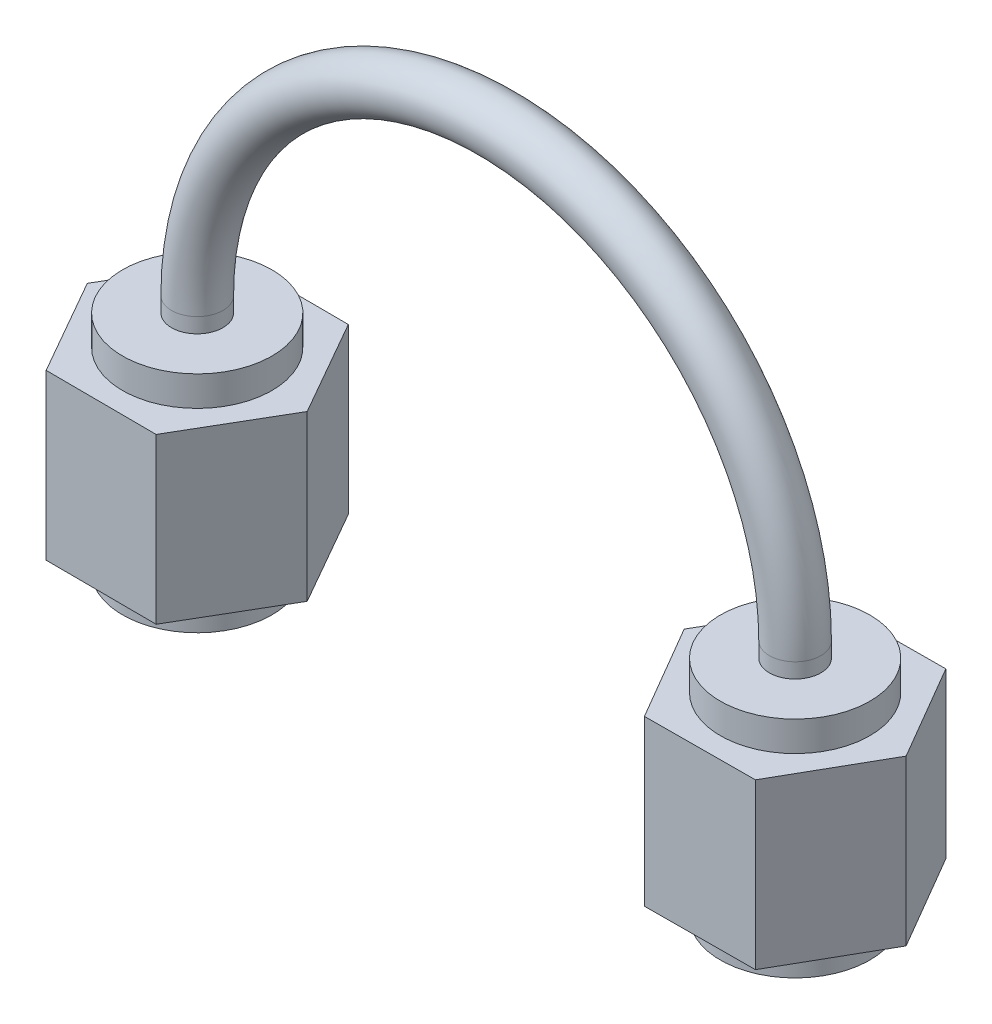
ISO-10303-21;
HEADER;
FILE_DESCRIPTION(('STEP AP214'),'2;1');
FILE_NAME('part.step','',(''),(''),'','','');
FILE_SCHEMA(('AUTOMOTIVE_DESIGN { 1 0 10303 214 1 1 1 1 }'));
ENDSEC;
DATA;
#1=APPLICATION_CONTEXT('core data for automotive mechanical design processes');
#2=APPLICATION_PROTOCOL_DEFINITION('international standard','automotive_design',2000,#1);
#3=PRODUCT_CONTEXT('',#1,'mechanical');
#4=PRODUCT('Part','Part','',(#3));
#5=PRODUCT_RELATED_PRODUCT_CATEGORY('part','',(#4));
#6=PRODUCT_DEFINITION_FORMATION('','',#4);
#7=PRODUCT_DEFINITION_CONTEXT('part definition',#1,'design');
#8=PRODUCT_DEFINITION('design','',#6,#7);
#9=PRODUCT_DEFINITION_SHAPE('','',#8);
#10=(LENGTH_UNIT() NAMED_UNIT(*) SI_UNIT(.MILLI.,.METRE.));
#11=(NAMED_UNIT(*) PLANE_ANGLE_UNIT() SI_UNIT($,.RADIAN.));
#12=(NAMED_UNIT(*) SI_UNIT($,.STERADIAN.) SOLID_ANGLE_UNIT());
#13=UNCERTAINTY_MEASURE_WITH_UNIT(LENGTH_MEASURE(1.E-05),#10,'distance_accuracy_value','');
#14=(GEOMETRIC_REPRESENTATION_CONTEXT(3) GLOBAL_UNCERTAINTY_ASSIGNED_CONTEXT((#13)) GLOBAL_UNIT_ASSIGNED_CONTEXT((#10,
#11,#12)) REPRESENTATION_CONTEXT('',''));
#15=CARTESIAN_POINT('',(0.,0.,0.));
#16=DIRECTION('',(0.,0.,1.));
#17=DIRECTION('',(1.,0.,0.));
#18=AXIS2_PLACEMENT_3D('',#15,#16,#17);
#19=CARTESIAN_POINT('',(-12.7,9.525,0.));
#20=DIRECTION('',(0.,-1.,0.));
#21=DIRECTION('',(0.,0.,-1.));
#22=AXIS2_PLACEMENT_3D('',#19,#20,#21);
#23=CYLINDRICAL_SURFACE('',#22,3.175);
#24=CARTESIAN_POINT('',(-12.7,0.,0.));
#25=DIRECTION('',(0.,1.,0.));
#26=DIRECTION('',(0.,0.,1.));
#27=AXIS2_PLACEMENT_3D('',#24,#25,#26);
#28=CIRCLE('',#27,3.175);
#29=CARTESIAN_POINT('',(-12.7,0.,-3.175));
#30=VERTEX_POINT('',#29);
#31=EDGE_CURVE('E180',#30,#30,#28,.T.);
#32=CARTESIAN_POINT('',(-12.7,1.27,0.));
#33=DIRECTION('',(0.,1.,0.));
#34=DIRECTION('',(0.,0.,1.));
#35=AXIS2_PLACEMENT_3D('',#32,#33,#34);
#36=CIRCLE('',#35,3.175);
#37=CARTESIAN_POINT('',(-12.7,1.27,-3.175));
#38=VERTEX_POINT('',#37);
#39=EDGE_CURVE('E47',#38,#38,#36,.T.);
#40=CARTESIAN_POINT('',(-12.7,0.,-3.175));
#41=CARTESIAN_POINT('',(-12.7,0.0132291666666666,-3.175));
#42=CARTESIAN_POINT('',(-12.7,0.0264583333333332,-3.175));
#43=CARTESIAN_POINT('',(-12.7,0.0529166666666664,-3.175));
#44=CARTESIAN_POINT('',(-12.7,0.066145833333333,-3.175));
#45=CARTESIAN_POINT('',(-12.7,0.0926041666666662,-3.175));
#46=CARTESIAN_POINT('',(-12.7,0.105833333333333,-3.175));
#47=CARTESIAN_POINT('',(-12.7,0.132291666666666,-3.175));
#48=CARTESIAN_POINT('',(-12.7,0.145520833333333,-3.175));
#49=CARTESIAN_POINT('',(-12.7,0.171979166666666,-3.175));
#50=CARTESIAN_POINT('',(-12.7,0.185208333333334,-3.175));
#51=CARTESIAN_POINT('',(-12.7,0.211666666666667,-3.175));
#52=CARTESIAN_POINT('',(-12.7,0.224895833333334,-3.175));
#53=CARTESIAN_POINT('',(-12.7,0.251354166666667,-3.175));
#54=CARTESIAN_POINT('',(-12.7,0.264583333333334,-3.175));
#55=CARTESIAN_POINT('',(-12.7,0.291041666666667,-3.175));
#56=CARTESIAN_POINT('',(-12.7,0.304270833333333,-3.175));
#57=CARTESIAN_POINT('',(-12.7,0.330729166666667,-3.175));
#58=CARTESIAN_POINT('',(-12.7,0.343958333333333,-3.175));
#59=CARTESIAN_POINT('',(-12.7,0.370416666666666,-3.175));
#60=CARTESIAN_POINT('',(-12.7,0.383645833333333,-3.175));
#61=CARTESIAN_POINT('',(-12.7,0.410104166666666,-3.175));
#62=CARTESIAN_POINT('',(-12.7,0.423333333333333,-3.175));
#63=CARTESIAN_POINT('',(-12.7,0.449791666666667,-3.175));
#64=CARTESIAN_POINT('',(-12.7,0.463020833333334,-3.175));
#65=CARTESIAN_POINT('',(-12.7,0.489479166666668,-3.175));
#66=CARTESIAN_POINT('',(-12.7,0.502708333333334,-3.175));
#67=CARTESIAN_POINT('',(-12.7,0.529166666666667,-3.175));
#68=CARTESIAN_POINT('',(-12.7,0.542395833333334,-3.175));
#69=CARTESIAN_POINT('',(-12.7,0.568854166666667,-3.175));
#70=CARTESIAN_POINT('',(-12.7,0.582083333333334,-3.175));
#71=CARTESIAN_POINT('',(-12.7,0.608541666666667,-3.175));
#72=CARTESIAN_POINT('',(-12.7,0.621770833333334,-3.175));
#73=CARTESIAN_POINT('',(-12.7,0.648229166666667,-3.175));
#74=CARTESIAN_POINT('',(-12.7,0.661458333333333,-3.175));
#75=CARTESIAN_POINT('',(-12.7,0.687916666666667,-3.175));
#76=CARTESIAN_POINT('',(-12.7,0.701145833333333,-3.175));
#77=CARTESIAN_POINT('',(-12.7,0.727604166666666,-3.175));
#78=CARTESIAN_POINT('',(-12.7,0.740833333333333,-3.175));
#79=CARTESIAN_POINT('',(-12.7,0.767291666666666,-3.175));
#80=CARTESIAN_POINT('',(-12.7,0.780520833333333,-3.175));
#81=CARTESIAN_POINT('',(-12.7,0.806979166666666,-3.175));
#82=CARTESIAN_POINT('',(-12.7,0.820208333333334,-3.175));
#83=CARTESIAN_POINT('',(-12.7,0.846666666666667,-3.175));
#84=CARTESIAN_POINT('',(-12.7,0.859895833333334,-3.175));
#85=CARTESIAN_POINT('',(-12.7,0.886354166666667,-3.175));
#86=CARTESIAN_POINT('',(-12.7,0.899583333333334,-3.175));
#87=CARTESIAN_POINT('',(-12.7,0.926041666666667,-3.175));
#88=CARTESIAN_POINT('',(-12.7,0.939270833333334,-3.175));
#89=CARTESIAN_POINT('',(-12.7,0.965729166666667,-3.175));
#90=CARTESIAN_POINT('',(-12.7,0.978958333333333,-3.175));
#91=CARTESIAN_POINT('',(-12.7,1.00541666666667,-3.175));
#92=CARTESIAN_POINT('',(-12.7,1.01864583333333,-3.175));
#93=CARTESIAN_POINT('',(-12.7,1.04510416666667,-3.175));
#94=CARTESIAN_POINT('',(-12.7,1.05833333333333,-3.175));
#95=CARTESIAN_POINT('',(-12.7,1.08479166666667,-3.175));
#96=CARTESIAN_POINT('',(-12.7,1.09802083333333,-3.175));
#97=CARTESIAN_POINT('',(-12.7,1.12447916666667,-3.175));
#98=CARTESIAN_POINT('',(-12.7,1.13770833333333,-3.175));
#99=CARTESIAN_POINT('',(-12.7,1.16416666666667,-3.175));
#100=CARTESIAN_POINT('',(-12.7,1.17739583333333,-3.175));
#101=CARTESIAN_POINT('',(-12.7,1.20385416666667,-3.175));
#102=CARTESIAN_POINT('',(-12.7,1.21708333333333,-3.175));
#103=CARTESIAN_POINT('',(-12.7,1.24354166666667,-3.175));
#104=CARTESIAN_POINT('',(-12.7,1.25677083333333,-3.175));
#105=CARTESIAN_POINT('',(-12.7,1.27,-3.175));
#106=B_SPLINE_CURVE_WITH_KNOTS('',3,(#40,#41,#42,#43,#44,#45,#46,#47,#48,#49,#50,#51,#52,#53,
#54,#55,#56,#57,#58,#59,#60,#61,#62,#63,#64,#65,#66,#67,#68,#69,#70,#71,#72,#73,#74,#75,#76,#77,
#78,#79,#80,#81,#82,#83,#84,#85,#86,#87,#88,#89,#90,#91,#92,#93,#94,#95,#96,#97,#98,#99,#100,
#101,#102,#103,#104,#105),.UNSPECIFIED.,.F.,.F.,(4,2,2,2,2,2,2,2,2,2,2,2,2,2,2,2,2,2,2,2,2,2,2,
2,2,2,2,2,2,2,2,2,4),(0.,0.0396874999999998,0.0793749999999996,0.119062499999999,
0.158749999999999,0.198437500000001,0.238125,0.2778125,0.3175,0.3571875,0.396875,
0.436562499999999,0.476250000000001,0.515937500000001,0.555625000000001,0.5953125,0.635,
0.6746875,0.714375,0.7540625,0.793749999999999,0.833437500000001,0.873125000000001,0.9128125,
0.9525,0.9921875,1.031875,1.0715625,1.11125,1.1509375,1.190625,1.2303125,1.27),.UNSPECIFIED.);
#107=EDGE_CURVE('BSEAM43',#30,#38,#106,.T.);
#108=ORIENTED_EDGE('',*,*,#31,.T.);
#109=ORIENTED_EDGE('',*,*,#39,.F.);
#110=ORIENTED_EDGE('',*,*,#107,.T.);
#111=ORIENTED_EDGE('',*,*,#107,.F.);
#112=EDGE_LOOP('',(#108,#110,#109,#111));
#113=FACE_BOUND('',#112,.T.);
#114=ADVANCED_FACE('F43',(#113),#23,.T.);
#115=CARTESIAN_POINT('',(-12.7,0.,0.));
#116=DIRECTION('',(0.,1.,0.));
#117=DIRECTION('',(0.,0.,1.));
#118=AXIS2_PLACEMENT_3D('',#115,#116,#117);
#119=PLANE('',#118);
#120=ORIENTED_EDGE('',*,*,#31,.F.);
#121=EDGE_LOOP('',(#120));
#122=FACE_BOUND('',#121,.T.);
#123=ADVANCED_FACE('F207',(#122),#119,.F.);
#124=CARTESIAN_POINT('',(-10.3724723460019,1.27,4.07480997755817));
#125=DIRECTION('',(0.863703301815548,0.,0.504000601619602));
#126=DIRECTION('',(0.504000601619602,0.,-0.863703301815548));
#127=AXIS2_PLACEMENT_3D('',#124,#125,#126);
#128=PLANE('',#127);
#129=DIRECTION('',(0.504000601619602,0.,-0.863703301815548));
#130=VECTOR('',#129,1.);
#131=CARTESIAN_POINT('',(-10.3724723460019,8.255,4.07480997755817));
#132=LINE('',#131,#130);
#133=CARTESIAN_POINT('',(-10.3724723460019,8.255,4.07480997755817));
#134=VERTEX_POINT('',#133);
#135=CARTESIAN_POINT('',(-8.0073472168413,8.255,0.0217069124059622));
#136=VERTEX_POINT('',#135);
#137=EDGE_CURVE('E141',#134,#136,#132,.T.);
#138=ORIENTED_EDGE('',*,*,#137,.F.);
#139=DIRECTION('',(0.,1.,0.));
#140=VECTOR('',#139,1.);
#141=CARTESIAN_POINT('',(-10.3724723460019,1.27,4.07480997755817));
#142=LINE('',#141,#140);
#143=CARTESIAN_POINT('',(-10.3724723460019,1.27,4.07480997755817));
#144=VERTEX_POINT('',#143);
#145=EDGE_CURVE('E62',#144,#134,#142,.T.);
#146=ORIENTED_EDGE('',*,*,#145,.F.);
#147=DIRECTION('',(0.504000601619602,0.,-0.863703301815548));
#148=VECTOR('',#147,1.);
#149=CARTESIAN_POINT('',(-10.3724723460019,1.27,4.07480997755817));
#150=LINE('',#149,#148);
#151=CARTESIAN_POINT('',(-8.0073472168413,1.27,0.0217069124059622));
#152=VERTEX_POINT('',#151);
#153=EDGE_CURVE('E163',#144,#152,#150,.T.);
#154=ORIENTED_EDGE('',*,*,#153,.T.);
#155=DIRECTION('',(0.,1.,0.));
#156=VECTOR('',#155,1.);
#157=CARTESIAN_POINT('',(-8.0073472168413,1.27,0.0217069124059622));
#158=LINE('',#157,#156);
#159=EDGE_CURVE('E98',#152,#136,#158,.T.);
#160=ORIENTED_EDGE('',*,*,#159,.T.);
#161=EDGE_LOOP('',(#138,#146,#154,#160));
#162=FACE_BOUND('',#161,.T.);
#163=ADVANCED_FACE('F194',(#162),#128,.T.);
#164=CARTESIAN_POINT('',(-15.0651251291606,1.27,4.05310306515221));
#165=DIRECTION('',(-0.00462567361744097,0.,0.999989301514564));
#166=DIRECTION('',(0.999989301514564,0.,0.00462567361744097));
#167=AXIS2_PLACEMENT_3D('',#164,#165,#166);
#168=PLANE('',#167);
#169=DIRECTION('',(0.999989301514564,0.,0.00462567361744097));
#170=VECTOR('',#169,1.);
#171=CARTESIAN_POINT('',(-15.0651251291606,8.255,4.05310306515221));
#172=LINE('',#171,#170);
#173=CARTESIAN_POINT('',(-15.0651251291606,8.255,4.05310306515221));
#174=VERTEX_POINT('',#173);
#175=EDGE_CURVE('E159',#174,#134,#172,.T.);
#176=ORIENTED_EDGE('',*,*,#175,.F.);
#177=DIRECTION('',(0.,1.,0.));
#178=VECTOR('',#177,1.);
#179=CARTESIAN_POINT('',(-15.0651251291606,1.27,4.05310306515221));
#180=LINE('',#179,#178);
#181=CARTESIAN_POINT('',(-15.0651251291606,1.27,4.05310306515221));
#182=VERTEX_POINT('',#181);
#183=EDGE_CURVE('E86',#182,#174,#180,.T.);
#184=ORIENTED_EDGE('',*,*,#183,.F.);
#185=DIRECTION('',(0.999989301514564,0.,0.00462567361744097));
#186=VECTOR('',#185,1.);
#187=CARTESIAN_POINT('',(-15.0651251291606,1.27,4.05310306515221));
#188=LINE('',#187,#186);
#189=EDGE_CURVE('E127',#182,#144,#188,.T.);
#190=ORIENTED_EDGE('',*,*,#189,.T.);
#191=ORIENTED_EDGE('',*,*,#145,.T.);
#192=EDGE_LOOP('',(#176,#184,#190,#191));
#193=FACE_BOUND('',#192,.T.);
#194=ADVANCED_FACE('F199',(#193),#168,.T.);
#195=CARTESIAN_POINT('',(-17.3926527831587,1.27,-0.0217069124059601));
#196=DIRECTION('',(-0.86832897543299,0.,0.495988699894962));
#197=DIRECTION('',(0.495988699894962,0.,0.86832897543299));
#198=AXIS2_PLACEMENT_3D('',#195,#196,#197);
#199=PLANE('',#198);
#200=DIRECTION('',(0.495988699894962,0.,0.86832897543299));
#201=VECTOR('',#200,1.);
#202=CARTESIAN_POINT('',(-17.3926527831587,8.255,-0.0217069124059601));
#203=LINE('',#202,#201);
#204=CARTESIAN_POINT('',(-17.3926527831587,8.255,-0.0217069124059601));
#205=VERTEX_POINT('',#204);
#206=EDGE_CURVE('E113',#205,#174,#203,.T.);
#207=ORIENTED_EDGE('',*,*,#206,.F.);
#208=DIRECTION('',(0.,1.,0.));
#209=VECTOR('',#208,1.);
#210=CARTESIAN_POINT('',(-17.3926527831587,1.27,-0.0217069124059601));
#211=LINE('',#210,#209);
#212=CARTESIAN_POINT('',(-17.3926527831587,1.27,-0.0217069124059601));
#213=VERTEX_POINT('',#212);
#214=EDGE_CURVE('E108',#213,#205,#211,.T.);
#215=ORIENTED_EDGE('',*,*,#214,.F.);
#216=DIRECTION('',(0.495988699894962,0.,0.86832897543299));
#217=VECTOR('',#216,1.);
#218=CARTESIAN_POINT('',(-17.3926527831587,1.27,-0.0217069124059601));
#219=LINE('',#218,#217);
#220=EDGE_CURVE('E111',#213,#182,#219,.T.);
#221=ORIENTED_EDGE('',*,*,#220,.T.);
#222=ORIENTED_EDGE('',*,*,#183,.T.);
#223=EDGE_LOOP('',(#207,#215,#221,#222));
#224=FACE_BOUND('',#223,.T.);
#225=ADVANCED_FACE('F110',(#224),#199,.T.);
#226=CARTESIAN_POINT('',(-15.0275276539981,1.27,-4.07480997755817));
#227=DIRECTION('',(-0.863703301815547,0.,-0.504000601619602));
#228=DIRECTION('',(-0.504000601619602,0.,0.863703301815548));
#229=AXIS2_PLACEMENT_3D('',#226,#227,#228);
#230=PLANE('',#229);
#231=DIRECTION('',(-0.504000601619603,0.,0.863703301815548));
#232=VECTOR('',#231,1.);
#233=CARTESIAN_POINT('',(-15.0275276539981,8.255,-4.07480997755817));
#234=LINE('',#233,#232);
#235=CARTESIAN_POINT('',(-15.0275276539981,8.255,-4.07480997755817));
#236=VERTEX_POINT('',#235);
#237=EDGE_CURVE('E154',#236,#205,#234,.T.);
#238=ORIENTED_EDGE('',*,*,#237,.F.);
#239=DIRECTION('',(0.,1.,0.));
#240=VECTOR('',#239,1.);
#241=CARTESIAN_POINT('',(-15.0275276539981,1.27,-4.07480997755817));
#242=LINE('',#241,#240);
#243=CARTESIAN_POINT('',(-15.0275276539981,1.27,-4.07480997755817));
#244=VERTEX_POINT('',#243);
#245=EDGE_CURVE('E119',#244,#236,#242,.T.);
#246=ORIENTED_EDGE('',*,*,#245,.F.);
#247=DIRECTION('',(-0.504000601619603,0.,0.863703301815548));
#248=VECTOR('',#247,1.);
#249=CARTESIAN_POINT('',(-15.0275276539981,1.27,-4.07480997755817));
#250=LINE('',#249,#248);
#251=EDGE_CURVE('E125',#244,#213,#250,.T.);
#252=ORIENTED_EDGE('',*,*,#251,.T.);
#253=ORIENTED_EDGE('',*,*,#214,.T.);
#254=EDGE_LOOP('',(#238,#246,#252,#253));
#255=FACE_BOUND('',#254,.T.);
#256=ADVANCED_FACE('F130',(#255),#230,.T.);
#257=CARTESIAN_POINT('',(-10.3348748708394,1.27,-4.05310306515221));
#258=DIRECTION('',(0.00462567361744134,0.,-0.999989301514564));
#259=DIRECTION('',(-0.999989301514564,0.,-0.00462567361744134));
#260=AXIS2_PLACEMENT_3D('',#257,#258,#259);
#261=PLANE('',#260);
#262=DIRECTION('',(-0.999989301514564,0.,-0.00462567361744134));
#263=VECTOR('',#262,1.);
#264=CARTESIAN_POINT('',(-10.3348748708394,8.255,-4.05310306515221));
#265=LINE('',#264,#263);
#266=CARTESIAN_POINT('',(-10.3348748708394,8.255,-4.05310306515221));
#267=VERTEX_POINT('',#266);
#268=EDGE_CURVE('E150',#267,#236,#265,.T.);
#269=ORIENTED_EDGE('',*,*,#268,.F.);
#270=DIRECTION('',(0.,1.,0.));
#271=VECTOR('',#270,1.);
#272=CARTESIAN_POINT('',(-10.3348748708394,1.27,-4.05310306515221));
#273=LINE('',#272,#271);
#274=CARTESIAN_POINT('',(-10.3348748708394,1.27,-4.05310306515221));
#275=VERTEX_POINT('',#274);
#276=EDGE_CURVE('E171',#275,#267,#273,.T.);
#277=ORIENTED_EDGE('',*,*,#276,.F.);
#278=DIRECTION('',(-0.999989301514564,0.,-0.00462567361744134));
#279=VECTOR('',#278,1.);
#280=CARTESIAN_POINT('',(-10.3348748708394,1.27,-4.05310306515221));
#281=LINE('',#280,#279);
#282=EDGE_CURVE('E132',#275,#244,#281,.T.);
#283=ORIENTED_EDGE('',*,*,#282,.T.);
#284=ORIENTED_EDGE('',*,*,#245,.T.);
#285=EDGE_LOOP('',(#269,#277,#283,#284));
#286=FACE_BOUND('',#285,.T.);
#287=ADVANCED_FACE('F198',(#286),#261,.T.);
#288=CARTESIAN_POINT('',(-8.0073472168413,1.27,0.0217069124059622));
#289=DIRECTION('',(0.86832897543299,0.,-0.495988699894961));
#290=DIRECTION('',(-0.495988699894961,0.,-0.86832897543299));
#291=AXIS2_PLACEMENT_3D('',#288,#289,#290);
#292=PLANE('',#291);
#293=DIRECTION('',(-0.495988699894961,0.,-0.86832897543299));
#294=VECTOR('',#293,1.);
#295=CARTESIAN_POINT('',(-8.0073472168413,8.255,0.0217069124059622));
#296=LINE('',#295,#294);
#297=EDGE_CURVE('E145',#136,#267,#296,.T.);
#298=ORIENTED_EDGE('',*,*,#297,.F.);
#299=ORIENTED_EDGE('',*,*,#159,.F.);
#300=DIRECTION('',(-0.495988699894961,0.,-0.86832897543299));
#301=VECTOR('',#300,1.);
#302=CARTESIAN_POINT('',(-8.0073472168413,1.27,0.0217069124059622));
#303=LINE('',#302,#301);
#304=EDGE_CURVE('E135',#152,#275,#303,.T.);
#305=ORIENTED_EDGE('',*,*,#304,.T.);
#306=ORIENTED_EDGE('',*,*,#276,.T.);
#307=EDGE_LOOP('',(#298,#299,#305,#306));
#308=FACE_BOUND('',#307,.T.);
#309=ADVANCED_FACE('F195',(#308),#292,.T.);
#310=CARTESIAN_POINT('',(0.,1.27,0.));
#311=DIRECTION('',(0.,1.,0.));
#312=DIRECTION('',(0.,0.,1.));
#313=AXIS2_PLACEMENT_3D('',#310,#311,#312);
#314=PLANE('',#313);
#315=ORIENTED_EDGE('',*,*,#39,.T.);
#316=EDGE_LOOP('',(#315));
#317=FACE_BOUND('',#316,.T.);
#318=ORIENTED_EDGE('',*,*,#153,.F.);
#319=ORIENTED_EDGE('',*,*,#189,.F.);
#320=ORIENTED_EDGE('',*,*,#220,.F.);
#321=ORIENTED_EDGE('',*,*,#251,.F.);
#322=ORIENTED_EDGE('',*,*,#282,.F.);
#323=ORIENTED_EDGE('',*,*,#304,.F.);
#324=EDGE_LOOP('',(#318,#319,#320,#321,#322,#323));
#325=FACE_BOUND('',#324,.T.);
#326=ADVANCED_FACE('F123',(#317,#325),#314,.F.);
#327=CARTESIAN_POINT('',(0.,8.255,0.));
#328=DIRECTION('',(0.,1.,0.));
#329=DIRECTION('',(0.,0.,1.));
#330=AXIS2_PLACEMENT_3D('',#327,#328,#329);
#331=PLANE('',#330);
#332=CARTESIAN_POINT('',(-12.7,8.255,0.));
#333=DIRECTION('',(0.,1.,0.));
#334=DIRECTION('',(0.,0.,1.));
#335=AXIS2_PLACEMENT_3D('',#332,#333,#334);
#336=CIRCLE('',#335,3.175);
#337=CARTESIAN_POINT('',(-12.7,8.255,-3.175));
#338=VERTEX_POINT('',#337);
#339=EDGE_CURVE('E166',#338,#338,#336,.T.);
#340=ORIENTED_EDGE('',*,*,#339,.F.);
#341=EDGE_LOOP('',(#340));
#342=FACE_BOUND('',#341,.T.);
#343=ORIENTED_EDGE('',*,*,#137,.T.);
#344=ORIENTED_EDGE('',*,*,#297,.T.);
#345=ORIENTED_EDGE('',*,*,#268,.T.);
#346=ORIENTED_EDGE('',*,*,#237,.T.);
#347=ORIENTED_EDGE('',*,*,#206,.T.);
#348=ORIENTED_EDGE('',*,*,#175,.T.);
#349=EDGE_LOOP('',(#343,#344,#345,#346,#347,#348));
#350=FACE_BOUND('',#349,.T.);
#351=ADVANCED_FACE('F189',(#342,#350),#331,.T.);
#352=CARTESIAN_POINT('',(-12.7,9.525,0.));
#353=DIRECTION('',(0.,1.,0.));
#354=DIRECTION('',(0.,0.,1.));
#355=AXIS2_PLACEMENT_3D('',#352,#353,#354);
#356=PLANE('',#355);
#357=CARTESIAN_POINT('',(-12.7,9.525,0.));
#358=DIRECTION('',(0.,1.,0.));
#359=DIRECTION('',(0.,0.,1.));
#360=AXIS2_PLACEMENT_3D('',#357,#358,#359);
#361=CIRCLE('',#360,1.0922);
#362=CARTESIAN_POINT('',(-12.7,9.525,1.0922));
#363=VERTEX_POINT('',#362);
#364=EDGE_CURVE('E11',#363,#363,#361,.T.);
#365=ORIENTED_EDGE('',*,*,#364,.F.);
#366=EDGE_LOOP('',(#365));
#367=FACE_BOUND('',#366,.T.);
#368=CARTESIAN_POINT('',(-12.7,9.525,0.));
#369=DIRECTION('',(0.,1.,0.));
#370=DIRECTION('',(0.,0.,1.));
#371=AXIS2_PLACEMENT_3D('',#368,#369,#370);
#372=CIRCLE('',#371,3.175);
#373=CARTESIAN_POINT('',(-12.7,9.525,-3.175));
#374=VERTEX_POINT('',#373);
#375=EDGE_CURVE('E176',#374,#374,#372,.T.);
#376=ORIENTED_EDGE('',*,*,#375,.T.);
#377=EDGE_LOOP('',(#376));
#378=FACE_BOUND('',#377,.T.);
#379=ADVANCED_FACE('F192',(#367,#378),#356,.T.);
#380=CARTESIAN_POINT('',(-12.7,8.255,-3.175));
#381=CARTESIAN_POINT('',(-12.7,8.26822916666667,-3.175));
#382=CARTESIAN_POINT('',(-12.7,8.28145833333333,-3.175));
#383=CARTESIAN_POINT('',(-12.7,8.30791666666667,-3.175));
#384=CARTESIAN_POINT('',(-12.7,8.32114583333333,-3.175));
#385=CARTESIAN_POINT('',(-12.7,8.34760416666667,-3.175));
#386=CARTESIAN_POINT('',(-12.7,8.36083333333333,-3.175));
#387=CARTESIAN_POINT('',(-12.7,8.38729166666667,-3.175));
#388=CARTESIAN_POINT('',(-12.7,8.40052083333333,-3.175));
#389=CARTESIAN_POINT('',(-12.7,8.42697916666667,-3.175));
#390=CARTESIAN_POINT('',(-12.7,8.44020833333333,-3.175));
#391=CARTESIAN_POINT('',(-12.7,8.46666666666667,-3.175));
#392=CARTESIAN_POINT('',(-12.7,8.47989583333333,-3.175));
#393=CARTESIAN_POINT('',(-12.7,8.50635416666667,-3.175));
#394=CARTESIAN_POINT('',(-12.7,8.51958333333333,-3.175));
#395=CARTESIAN_POINT('',(-12.7,8.54604166666667,-3.175));
#396=CARTESIAN_POINT('',(-12.7,8.55927083333333,-3.175));
#397=CARTESIAN_POINT('',(-12.7,8.58572916666667,-3.175));
#398=CARTESIAN_POINT('',(-12.7,8.59895833333333,-3.175));
#399=CARTESIAN_POINT('',(-12.7,8.62541666666667,-3.175));
#400=CARTESIAN_POINT('',(-12.7,8.63864583333333,-3.175));
#401=CARTESIAN_POINT('',(-12.7,8.66510416666667,-3.175));
#402=CARTESIAN_POINT('',(-12.7,8.67833333333333,-3.175));
#403=CARTESIAN_POINT('',(-12.7,8.70479166666667,-3.175));
#404=CARTESIAN_POINT('',(-12.7,8.71802083333333,-3.175));
#405=CARTESIAN_POINT('',(-12.7,8.74447916666667,-3.175));
#406=CARTESIAN_POINT('',(-12.7,8.75770833333333,-3.175));
#407=CARTESIAN_POINT('',(-12.7,8.78416666666667,-3.175));
#408=CARTESIAN_POINT('',(-12.7,8.79739583333333,-3.175));
#409=CARTESIAN_POINT('',(-12.7,8.82385416666667,-3.175));
#410=CARTESIAN_POINT('',(-12.7,8.83708333333333,-3.175));
#411=CARTESIAN_POINT('',(-12.7,8.86354166666666,-3.175));
#412=CARTESIAN_POINT('',(-12.7,8.87677083333333,-3.175));
#413=CARTESIAN_POINT('',(-12.7,8.90322916666667,-3.175));
#414=CARTESIAN_POINT('',(-12.7,8.91645833333333,-3.175));
#415=CARTESIAN_POINT('',(-12.7,8.94291666666667,-3.175));
#416=CARTESIAN_POINT('',(-12.7,8.95614583333333,-3.175));
#417=CARTESIAN_POINT('',(-12.7,8.98260416666667,-3.175));
#418=CARTESIAN_POINT('',(-12.7,8.99583333333333,-3.175));
#419=CARTESIAN_POINT('',(-12.7,9.02229166666667,-3.175));
#420=CARTESIAN_POINT('',(-12.7,9.03552083333333,-3.175));
#421=CARTESIAN_POINT('',(-12.7,9.06197916666667,-3.175));
#422=CARTESIAN_POINT('',(-12.7,9.07520833333333,-3.175));
#423=CARTESIAN_POINT('',(-12.7,9.10166666666667,-3.175));
#424=CARTESIAN_POINT('',(-12.7,9.11489583333333,-3.175));
#425=CARTESIAN_POINT('',(-12.7,9.14135416666667,-3.175));
#426=CARTESIAN_POINT('',(-12.7,9.15458333333333,-3.175));
#427=CARTESIAN_POINT('',(-12.7,9.18104166666667,-3.175));
#428=CARTESIAN_POINT('',(-12.7,9.19427083333333,-3.175));
#429=CARTESIAN_POINT('',(-12.7,9.22072916666667,-3.175));
#430=CARTESIAN_POINT('',(-12.7,9.23395833333333,-3.175));
#431=CARTESIAN_POINT('',(-12.7,9.26041666666667,-3.175));
#432=CARTESIAN_POINT('',(-12.7,9.27364583333333,-3.175));
#433=CARTESIAN_POINT('',(-12.7,9.30010416666667,-3.175));
#434=CARTESIAN_POINT('',(-12.7,9.31333333333333,-3.175));
#435=CARTESIAN_POINT('',(-12.7,9.33979166666667,-3.175));
#436=CARTESIAN_POINT('',(-12.7,9.35302083333333,-3.175));
#437=CARTESIAN_POINT('',(-12.7,9.37947916666667,-3.175));
#438=CARTESIAN_POINT('',(-12.7,9.39270833333333,-3.175));
#439=CARTESIAN_POINT('',(-12.7,9.41916666666667,-3.175));
#440=CARTESIAN_POINT('',(-12.7,9.43239583333333,-3.175));
#441=CARTESIAN_POINT('',(-12.7,9.45885416666667,-3.175));
#442=CARTESIAN_POINT('',(-12.7,9.47208333333333,-3.175));
#443=CARTESIAN_POINT('',(-12.7,9.49854166666667,-3.175));
#444=CARTESIAN_POINT('',(-12.7,9.51177083333333,-3.175));
#445=CARTESIAN_POINT('',(-12.7,9.525,-3.175));
#446=B_SPLINE_CURVE_WITH_KNOTS('',3,(#380,#381,#382,#383,#384,#385,#386,#387,#388,#389,#390,
#391,#392,#393,#394,#395,#396,#397,#398,#399,#400,#401,#402,#403,#404,#405,#406,#407,#408,#409,
#410,#411,#412,#413,#414,#415,#416,#417,#418,#419,#420,#421,#422,#423,#424,#425,#426,#427,#428,
#429,#430,#431,#432,#433,#434,#435,#436,#437,#438,#439,#440,#441,#442,#443,#444,#445),
.UNSPECIFIED.,.F.,.F.,(4,2,2,2,2,2,2,2,2,2,2,2,2,2,2,2,2,2,2,2,2,2,2,2,2,2,2,2,2,2,2,2,4),(0.,
0.0396874999999998,0.0793749999999996,0.119062499999999,0.158749999999999,0.198437499999999,
0.238124999999999,0.2778125,0.3175,0.3571875,0.396875,0.436562499999999,0.476249999999999,
0.515937499999999,0.555624999999999,0.595312499999999,0.635,0.6746875,0.714375,0.7540625,
0.793749999999999,0.833437499999999,0.873124999999999,0.912812499999999,0.9525,0.9921875,
1.031875,1.0715625,1.11125,1.1509375,1.190625,1.2303125,1.27),.UNSPECIFIED.);
#447=EDGE_CURVE('BSEAM45',#338,#374,#446,.T.);
#448=ORIENTED_EDGE('',*,*,#339,.T.);
#449=ORIENTED_EDGE('',*,*,#375,.F.);
#450=ORIENTED_EDGE('',*,*,#447,.T.);
#451=ORIENTED_EDGE('',*,*,#447,.F.);
#452=EDGE_LOOP('',(#448,#450,#449,#451));
#453=FACE_BOUND('',#452,.T.);
#454=ADVANCED_FACE('F45',(#453),#23,.T.);
#455=CARTESIAN_POINT('',(12.7,9.525,0.));
#456=DIRECTION('',(0.,1.,0.));
#457=DIRECTION('',(0.,0.,1.));
#458=AXIS2_PLACEMENT_3D('',#455,#456,#457);
#459=CYLINDRICAL_SURFACE('',#458,1.0922);
#460=CARTESIAN_POINT('',(12.7,10.16,0.));
#461=DIRECTION('',(0.,-1.,0.));
#462=DIRECTION('',(0.,0.,1.));
#463=AXIS2_PLACEMENT_3D('',#460,#461,#462);
#464=CIRCLE('',#463,1.0922);
#465=CARTESIAN_POINT('',(13.7922,10.16,0.));
#466=VERTEX_POINT('',#465);
#467=EDGE_CURVE('E484',#466,#466,#464,.T.);
#468=ORIENTED_EDGE('',*,*,#467,.T.);
#469=EDGE_LOOP('',(#468));
#470=FACE_BOUND('',#469,.T.);
#471=CARTESIAN_POINT('',(12.7,9.525,0.));
#472=DIRECTION('',(0.,-1.,0.));
#473=DIRECTION('',(0.,0.,1.));
#474=AXIS2_PLACEMENT_3D('',#471,#472,#473);
#475=CIRCLE('',#474,1.0922);
#476=CARTESIAN_POINT('',(12.7,9.525,1.0922));
#477=VERTEX_POINT('',#476);
#478=EDGE_CURVE('E480',#477,#477,#475,.T.);
#479=ORIENTED_EDGE('',*,*,#478,.F.);
#480=EDGE_LOOP('',(#479));
#481=FACE_BOUND('',#480,.T.);
#482=ADVANCED_FACE('F217',(#470,#481),#459,.T.);
#483=CARTESIAN_POINT('',(0.,10.16,0.));
#484=DIRECTION('',(0.,0.,1.));
#485=DIRECTION('',(1.,0.,0.));
#486=AXIS2_PLACEMENT_3D('',#483,#484,#485);
#487=TOROIDAL_SURFACE('',#486,12.7,1.0922);
#488=CARTESIAN_POINT('',(-12.7,10.16,0.));
#489=DIRECTION('',(0.,1.,0.));
#490=DIRECTION('',(0.,0.,1.));
#491=AXIS2_PLACEMENT_3D('',#488,#489,#490);
#492=CIRCLE('',#491,1.0922);
#493=CARTESIAN_POINT('',(-13.7922,10.16,0.));
#494=VERTEX_POINT('',#493);
#495=EDGE_CURVE('E146',#494,#494,#492,.T.);
#496=CARTESIAN_POINT('',(0.,10.16,0.));
#497=DIRECTION('',(0.,0.,1.));
#498=DIRECTION('',(1.,0.,0.));
#499=AXIS2_PLACEMENT_3D('',#496,#497,#498);
#500=CIRCLE('',#499,13.7922);
#501=EDGE_CURVE('',#466,#494,#500,.T.);
#502=ORIENTED_EDGE('',*,*,#467,.F.);
#503=ORIENTED_EDGE('',*,*,#495,.T.);
#504=ORIENTED_EDGE('',*,*,#501,.T.);
#505=ORIENTED_EDGE('',*,*,#501,.F.);
#506=EDGE_LOOP('',(#502,#504,#503,#505));
#507=FACE_BOUND('',#506,.T.);
#508=ADVANCED_FACE('F224',(#507),#487,.T.);
#509=CARTESIAN_POINT('',(-12.7,10.16,0.));
#510=DIRECTION('',(0.,-1.,0.));
#511=DIRECTION('',(0.,0.,-1.));
#512=AXIS2_PLACEMENT_3D('',#509,#510,#511);
#513=CYLINDRICAL_SURFACE('',#512,1.0922);
#514=ORIENTED_EDGE('',*,*,#364,.T.);
#515=EDGE_LOOP('',(#514));
#516=FACE_BOUND('',#515,.T.);
#517=ORIENTED_EDGE('',*,*,#495,.F.);
#518=EDGE_LOOP('',(#517));
#519=FACE_BOUND('',#518,.T.);
#520=ADVANCED_FACE('F218',(#516,#519),#513,.T.);
#521=CARTESIAN_POINT('',(12.7,9.525,0.));
#522=DIRECTION('',(0.,-1.,0.));
#523=DIRECTION('',(0.,0.,-1.));
#524=AXIS2_PLACEMENT_3D('',#521,#522,#523);
#525=CYLINDRICAL_SURFACE('',#524,3.17500000000001);
#526=CARTESIAN_POINT('',(12.7,0.,0.));
#527=DIRECTION('',(0.,1.,0.));
#528=DIRECTION('',(0.,0.,1.));
#529=AXIS2_PLACEMENT_3D('',#526,#527,#528);
#530=CIRCLE('',#529,3.17500000000001);
#531=CARTESIAN_POINT('',(12.7,0.,-3.17500000000001));
#532=VERTEX_POINT('',#531);
#533=EDGE_CURVE('E466',#532,#532,#530,.T.);
#534=CARTESIAN_POINT('',(12.7,1.27,0.));
#535=DIRECTION('',(0.,1.,0.));
#536=DIRECTION('',(0.,0.,1.));
#537=AXIS2_PLACEMENT_3D('',#534,#535,#536);
#538=CIRCLE('',#537,3.17500000000001);
#539=CARTESIAN_POINT('',(12.7,1.27,-3.17500000000001));
#540=VERTEX_POINT('',#539);
#541=EDGE_CURVE('E471',#540,#540,#538,.T.);
#542=CARTESIAN_POINT('',(12.7,0.,-3.17500000000001));
#543=CARTESIAN_POINT('',(12.7,0.0132291666666666,-3.17500000000001));
#544=CARTESIAN_POINT('',(12.7,0.0264583333333332,-3.17500000000001));
#545=CARTESIAN_POINT('',(12.7,0.0529166666666664,-3.17500000000001));
#546=CARTESIAN_POINT('',(12.7,0.066145833333333,-3.17500000000001));
#547=CARTESIAN_POINT('',(12.7,0.0926041666666662,-3.17500000000001));
#548=CARTESIAN_POINT('',(12.7,0.105833333333333,-3.17500000000001));
#549=CARTESIAN_POINT('',(12.7,0.132291666666666,-3.17500000000001));
#550=CARTESIAN_POINT('',(12.7,0.145520833333333,-3.17500000000001));
#551=CARTESIAN_POINT('',(12.7,0.171979166666666,-3.17500000000001));
#552=CARTESIAN_POINT('',(12.7,0.185208333333334,-3.17500000000001));
#553=CARTESIAN_POINT('',(12.7,0.211666666666667,-3.17500000000001));
#554=CARTESIAN_POINT('',(12.7,0.224895833333334,-3.17500000000001));
#555=CARTESIAN_POINT('',(12.7,0.251354166666667,-3.17500000000001));
#556=CARTESIAN_POINT('',(12.7,0.264583333333334,-3.17500000000001));
#557=CARTESIAN_POINT('',(12.7,0.291041666666667,-3.17500000000001));
#558=CARTESIAN_POINT('',(12.7,0.304270833333333,-3.17500000000001));
#559=CARTESIAN_POINT('',(12.7,0.330729166666667,-3.17500000000001));
#560=CARTESIAN_POINT('',(12.7,0.343958333333333,-3.17500000000001));
#561=CARTESIAN_POINT('',(12.7,0.370416666666666,-3.17500000000001));
#562=CARTESIAN_POINT('',(12.7,0.383645833333333,-3.17500000000001));
#563=CARTESIAN_POINT('',(12.7,0.410104166666666,-3.17500000000001));
#564=CARTESIAN_POINT('',(12.7,0.423333333333333,-3.17500000000001));
#565=CARTESIAN_POINT('',(12.7,0.449791666666667,-3.17500000000001));
#566=CARTESIAN_POINT('',(12.7,0.463020833333334,-3.17500000000001));
#567=CARTESIAN_POINT('',(12.7,0.489479166666668,-3.17500000000001));
#568=CARTESIAN_POINT('',(12.7,0.502708333333334,-3.17500000000001));
#569=CARTESIAN_POINT('',(12.7,0.529166666666667,-3.17500000000001));
#570=CARTESIAN_POINT('',(12.7,0.542395833333334,-3.17500000000001));
#571=CARTESIAN_POINT('',(12.7,0.568854166666667,-3.17500000000001));
#572=CARTESIAN_POINT('',(12.7,0.582083333333334,-3.17500000000001));
#573=CARTESIAN_POINT('',(12.7,0.608541666666667,-3.17500000000001));
#574=CARTESIAN_POINT('',(12.7,0.621770833333334,-3.17500000000001));
#575=CARTESIAN_POINT('',(12.7,0.648229166666667,-3.17500000000001));
#576=CARTESIAN_POINT('',(12.7,0.661458333333333,-3.17500000000001));
#577=CARTESIAN_POINT('',(12.7,0.687916666666667,-3.17500000000001));
#578=CARTESIAN_POINT('',(12.7,0.701145833333333,-3.17500000000001));
#579=CARTESIAN_POINT('',(12.7,0.727604166666666,-3.17500000000001));
#580=CARTESIAN_POINT('',(12.7,0.740833333333333,-3.17500000000001));
#581=CARTESIAN_POINT('',(12.7,0.767291666666666,-3.17500000000001));
#582=CARTESIAN_POINT('',(12.7,0.780520833333333,-3.17500000000001));
#583=CARTESIAN_POINT('',(12.7,0.806979166666666,-3.17500000000001));
#584=CARTESIAN_POINT('',(12.7,0.820208333333334,-3.17500000000001));
#585=CARTESIAN_POINT('',(12.7,0.846666666666667,-3.17500000000001));
#586=CARTESIAN_POINT('',(12.7,0.859895833333334,-3.17500000000001));
#587=CARTESIAN_POINT('',(12.7,0.886354166666667,-3.17500000000001));
#588=CARTESIAN_POINT('',(12.7,0.899583333333334,-3.17500000000001));
#589=CARTESIAN_POINT('',(12.7,0.926041666666667,-3.17500000000001));
#590=CARTESIAN_POINT('',(12.7,0.939270833333334,-3.17500000000001));
#591=CARTESIAN_POINT('',(12.7,0.965729166666667,-3.17500000000001));
#592=CARTESIAN_POINT('',(12.7,0.978958333333333,-3.17500000000001));
#593=CARTESIAN_POINT('',(12.7,1.00541666666667,-3.17500000000001));
#594=CARTESIAN_POINT('',(12.7,1.01864583333333,-3.17500000000001));
#595=CARTESIAN_POINT('',(12.7,1.04510416666667,-3.17500000000001));
#596=CARTESIAN_POINT('',(12.7,1.05833333333333,-3.17500000000001));
#597=CARTESIAN_POINT('',(12.7,1.08479166666667,-3.17500000000001));
#598=CARTESIAN_POINT('',(12.7,1.09802083333333,-3.17500000000001));
#599=CARTESIAN_POINT('',(12.7,1.12447916666667,-3.17500000000001));
#600=CARTESIAN_POINT('',(12.7,1.13770833333333,-3.17500000000001));
#601=CARTESIAN_POINT('',(12.7,1.16416666666667,-3.17500000000001));
#602=CARTESIAN_POINT('',(12.7,1.17739583333333,-3.17500000000001));
#603=CARTESIAN_POINT('',(12.7,1.20385416666667,-3.17500000000001));
#604=CARTESIAN_POINT('',(12.7,1.21708333333333,-3.17500000000001));
#605=CARTESIAN_POINT('',(12.7,1.24354166666667,-3.17500000000001));
#606=CARTESIAN_POINT('',(12.7,1.25677083333333,-3.17500000000001));
#607=CARTESIAN_POINT('',(12.7,1.27,-3.17500000000001));
#608=B_SPLINE_CURVE_WITH_KNOTS('',3,(#542,#543,#544,#545,#546,#547,#548,#549,#550,#551,#552,
#553,#554,#555,#556,#557,#558,#559,#560,#561,#562,#563,#564,#565,#566,#567,#568,#569,#570,#571,
#572,#573,#574,#575,#576,#577,#578,#579,#580,#581,#582,#583,#584,#585,#586,#587,#588,#589,#590,
#591,#592,#593,#594,#595,#596,#597,#598,#599,#600,#601,#602,#603,#604,#605,#606,#607),
.UNSPECIFIED.,.F.,.F.,(4,2,2,2,2,2,2,2,2,2,2,2,2,2,2,2,2,2,2,2,2,2,2,2,2,2,2,2,2,2,2,2,4),(0.,
0.0396874999999998,0.0793749999999996,0.119062499999999,0.158749999999999,0.198437500000001,
0.238125,0.2778125,0.3175,0.3571875,0.396875,0.436562499999999,0.476250000000001,
0.515937500000001,0.555625000000001,0.5953125,0.635,0.6746875,0.714375,0.7540625,
0.793749999999999,0.833437500000001,0.873125000000001,0.9128125,0.9525,0.9921875,1.031875,
1.0715625,1.11125,1.1509375,1.190625,1.2303125,1.27),.UNSPECIFIED.);
#609=EDGE_CURVE('BSEAM227',#532,#540,#608,.T.);
#610=ORIENTED_EDGE('',*,*,#533,.T.);
#611=ORIENTED_EDGE('',*,*,#541,.F.);
#612=ORIENTED_EDGE('',*,*,#609,.T.);
#613=ORIENTED_EDGE('',*,*,#609,.F.);
#614=EDGE_LOOP('',(#610,#612,#611,#613));
#615=FACE_BOUND('',#614,.T.);
#616=ADVANCED_FACE('F227',(#615),#525,.T.);
#617=CARTESIAN_POINT('',(12.7,0.,0.));
#618=DIRECTION('',(0.,1.,0.));
#619=DIRECTION('',(0.,0.,1.));
#620=AXIS2_PLACEMENT_3D('',#617,#618,#619);
#621=PLANE('',#620);
#622=ORIENTED_EDGE('',*,*,#533,.F.);
#623=EDGE_LOOP('',(#622));
#624=FACE_BOUND('',#623,.T.);
#625=ADVANCED_FACE('F238',(#624),#621,.F.);
#626=CARTESIAN_POINT('',(10.3724723460019,1.27,4.07480997755817));
#627=DIRECTION('',(-0.863703301815548,0.,0.504000601619602));
#628=DIRECTION('',(-0.504000601619602,0.,-0.863703301815548));
#629=AXIS2_PLACEMENT_3D('',#626,#627,#628);
#630=PLANE('',#629);
#631=DIRECTION('',(-0.504000601619602,0.,-0.863703301815548));
#632=VECTOR('',#631,1.);
#633=CARTESIAN_POINT('',(10.3724723460019,8.255,4.07480997755817));
#634=LINE('',#633,#632);
#635=CARTESIAN_POINT('',(10.3724723460019,8.255,4.07480997755817));
#636=VERTEX_POINT('',#635);
#637=CARTESIAN_POINT('',(8.0073472168413,8.255,0.0217069124059622));
#638=VERTEX_POINT('',#637);
#639=EDGE_CURVE('E529',#636,#638,#634,.T.);
#640=ORIENTED_EDGE('',*,*,#639,.T.);
#641=DIRECTION('',(0.,1.,0.));
#642=VECTOR('',#641,1.);
#643=CARTESIAN_POINT('',(8.0073472168413,1.27,0.0217069124059622));
#644=LINE('',#643,#642);
#645=CARTESIAN_POINT('',(8.0073472168413,1.27,0.0217069124059622));
#646=VERTEX_POINT('',#645);
#647=EDGE_CURVE('E526',#646,#638,#644,.T.);
#648=ORIENTED_EDGE('',*,*,#647,.F.);
#649=DIRECTION('',(-0.504000601619602,0.,-0.863703301815548));
#650=VECTOR('',#649,1.);
#651=CARTESIAN_POINT('',(10.3724723460019,1.27,4.07480997755817));
#652=LINE('',#651,#650);
#653=CARTESIAN_POINT('',(10.3724723460019,1.27,4.07480997755817));
#654=VERTEX_POINT('',#653);
#655=EDGE_CURVE('E506',#654,#646,#652,.T.);
#656=ORIENTED_EDGE('',*,*,#655,.F.);
#657=DIRECTION('',(0.,1.,0.));
#658=VECTOR('',#657,1.);
#659=CARTESIAN_POINT('',(10.3724723460019,1.27,4.07480997755817));
#660=LINE('',#659,#658);
#661=EDGE_CURVE('E473',#654,#636,#660,.T.);
#662=ORIENTED_EDGE('',*,*,#661,.T.);
#663=EDGE_LOOP('',(#640,#648,#656,#662));
#664=FACE_BOUND('',#663,.T.);
#665=ADVANCED_FACE('F328',(#664),#630,.T.);
#666=CARTESIAN_POINT('',(15.0651251291606,1.27,4.05310306515221));
#667=DIRECTION('',(0.00462567361744097,0.,0.999989301514564));
#668=DIRECTION('',(-0.999989301514564,0.,0.00462567361744097));
#669=AXIS2_PLACEMENT_3D('',#666,#667,#668);
#670=PLANE('',#669);
#671=DIRECTION('',(-0.999989301514564,0.,0.00462567361744097));
#672=VECTOR('',#671,1.);
#673=CARTESIAN_POINT('',(15.0651251291606,8.255,4.05310306515221));
#674=LINE('',#673,#672);
#675=CARTESIAN_POINT('',(15.0651251291606,8.255,4.05310306515221));
#676=VERTEX_POINT('',#675);
#677=EDGE_CURVE('E532',#676,#636,#674,.T.);
#678=ORIENTED_EDGE('',*,*,#677,.T.);
#679=ORIENTED_EDGE('',*,*,#661,.F.);
#680=DIRECTION('',(-0.999989301514564,0.,0.00462567361744097));
#681=VECTOR('',#680,1.);
#682=CARTESIAN_POINT('',(15.0651251291606,1.27,4.05310306515221));
#683=LINE('',#682,#681);
#684=CARTESIAN_POINT('',(15.0651251291606,1.27,4.05310306515221));
#685=VERTEX_POINT('',#684);
#686=EDGE_CURVE('E516',#685,#654,#683,.T.);
#687=ORIENTED_EDGE('',*,*,#686,.F.);
#688=DIRECTION('',(0.,1.,0.));
#689=VECTOR('',#688,1.);
#690=CARTESIAN_POINT('',(15.0651251291606,1.27,4.05310306515221));
#691=LINE('',#690,#689);
#692=EDGE_CURVE('E565',#685,#676,#691,.T.);
#693=ORIENTED_EDGE('',*,*,#692,.T.);
#694=EDGE_LOOP('',(#678,#679,#687,#693));
#695=FACE_BOUND('',#694,.T.);
#696=ADVANCED_FACE('F336',(#695),#670,.T.);
#697=CARTESIAN_POINT('',(17.3926527831587,1.27,-0.0217069124059601));
#698=DIRECTION('',(0.86832897543299,0.,0.495988699894962));
#699=DIRECTION('',(-0.495988699894962,0.,0.86832897543299));
#700=AXIS2_PLACEMENT_3D('',#697,#698,#699);
#701=PLANE('',#700);
#702=DIRECTION('',(-0.495988699894962,0.,0.86832897543299));
#703=VECTOR('',#702,1.);
#704=CARTESIAN_POINT('',(17.3926527831587,8.255,-0.0217069124059601));
#705=LINE('',#704,#703);
#706=CARTESIAN_POINT('',(17.3926527831587,8.255,-0.0217069124059601));
#707=VERTEX_POINT('',#706);
#708=EDGE_CURVE('E538',#707,#676,#705,.T.);
#709=ORIENTED_EDGE('',*,*,#708,.T.);
#710=ORIENTED_EDGE('',*,*,#692,.F.);
#711=DIRECTION('',(-0.495988699894962,0.,0.86832897543299));
#712=VECTOR('',#711,1.);
#713=CARTESIAN_POINT('',(17.3926527831587,1.27,-0.0217069124059601));
#714=LINE('',#713,#712);
#715=CARTESIAN_POINT('',(17.3926527831587,1.27,-0.0217069124059601));
#716=VERTEX_POINT('',#715);
#717=EDGE_CURVE('E547',#716,#685,#714,.T.);
#718=ORIENTED_EDGE('',*,*,#717,.F.);
#719=DIRECTION('',(0.,1.,0.));
#720=VECTOR('',#719,1.);
#721=CARTESIAN_POINT('',(17.3926527831587,1.27,-0.0217069124059601));
#722=LINE('',#721,#720);
#723=EDGE_CURVE('E561',#716,#707,#722,.T.);
#724=ORIENTED_EDGE('',*,*,#723,.T.);
#725=EDGE_LOOP('',(#709,#710,#718,#724));
#726=FACE_BOUND('',#725,.T.);
#727=ADVANCED_FACE('F344',(#726),#701,.T.);
#728=CARTESIAN_POINT('',(15.0275276539981,1.27,-4.07480997755817));
#729=DIRECTION('',(0.863703301815547,0.,-0.504000601619602));
#730=DIRECTION('',(0.504000601619602,0.,0.863703301815548));
#731=AXIS2_PLACEMENT_3D('',#728,#729,#730);
#732=PLANE('',#731);
#733=DIRECTION('',(0.504000601619603,0.,0.863703301815548));
#734=VECTOR('',#733,1.);
#735=CARTESIAN_POINT('',(15.0275276539981,8.255,-4.07480997755817));
#736=LINE('',#735,#734);
#737=CARTESIAN_POINT('',(15.0275276539981,8.255,-4.07480997755817));
#738=VERTEX_POINT('',#737);
#739=EDGE_CURVE('E586',#738,#707,#736,.T.);
#740=ORIENTED_EDGE('',*,*,#739,.T.);
#741=ORIENTED_EDGE('',*,*,#723,.F.);
#742=DIRECTION('',(0.504000601619603,0.,0.863703301815548));
#743=VECTOR('',#742,1.);
#744=CARTESIAN_POINT('',(15.0275276539981,1.27,-4.07480997755817));
#745=LINE('',#744,#743);
#746=CARTESIAN_POINT('',(15.0275276539981,1.27,-4.07480997755817));
#747=VERTEX_POINT('',#746);
#748=EDGE_CURVE('E550',#747,#716,#745,.T.);
#749=ORIENTED_EDGE('',*,*,#748,.F.);
#750=DIRECTION('',(0.,1.,0.));
#751=VECTOR('',#750,1.);
#752=CARTESIAN_POINT('',(15.0275276539981,1.27,-4.07480997755817));
#753=LINE('',#752,#751);
#754=EDGE_CURVE('E557',#747,#738,#753,.T.);
#755=ORIENTED_EDGE('',*,*,#754,.T.);
#756=EDGE_LOOP('',(#740,#741,#749,#755));
#757=FACE_BOUND('',#756,.T.);
#758=ADVANCED_FACE('F352',(#757),#732,.T.);
#759=CARTESIAN_POINT('',(10.3348748708394,1.27,-4.05310306515221));
#760=DIRECTION('',(-0.00462567361744134,0.,-0.999989301514564));
#761=DIRECTION('',(0.999989301514564,0.,-0.00462567361744134));
#762=AXIS2_PLACEMENT_3D('',#759,#760,#761);
#763=PLANE('',#762);
#764=DIRECTION('',(0.999989301514564,0.,-0.00462567361744134));
#765=VECTOR('',#764,1.);
#766=CARTESIAN_POINT('',(10.3348748708394,8.255,-4.05310306515221));
#767=LINE('',#766,#765);
#768=CARTESIAN_POINT('',(10.3348748708394,8.255,-4.05310306515221));
#769=VERTEX_POINT('',#768);
#770=EDGE_CURVE('E580',#769,#738,#767,.T.);
#771=ORIENTED_EDGE('',*,*,#770,.T.);
#772=ORIENTED_EDGE('',*,*,#754,.F.);
#773=DIRECTION('',(0.999989301514564,0.,-0.00462567361744134));
#774=VECTOR('',#773,1.);
#775=CARTESIAN_POINT('',(10.3348748708394,1.27,-4.05310306515221));
#776=LINE('',#775,#774);
#777=CARTESIAN_POINT('',(10.3348748708394,1.27,-4.05310306515221));
#778=VERTEX_POINT('',#777);
#779=EDGE_CURVE('E554',#778,#747,#776,.T.);
#780=ORIENTED_EDGE('',*,*,#779,.F.);
#781=DIRECTION('',(0.,1.,0.));
#782=VECTOR('',#781,1.);
#783=CARTESIAN_POINT('',(10.3348748708394,1.27,-4.05310306515221));
#784=LINE('',#783,#782);
#785=EDGE_CURVE('E522',#778,#769,#784,.T.);
#786=ORIENTED_EDGE('',*,*,#785,.T.);
#787=EDGE_LOOP('',(#771,#772,#780,#786));
#788=FACE_BOUND('',#787,.T.);
#789=ADVANCED_FACE('F360',(#788),#763,.T.);
#790=CARTESIAN_POINT('',(0.,1.27,0.));
#791=DIRECTION('',(0.,1.,0.));
#792=DIRECTION('',(0.,0.,1.));
#793=AXIS2_PLACEMENT_3D('',#790,#791,#792);
#794=PLANE('',#793);
#795=ORIENTED_EDGE('',*,*,#541,.T.);
#796=EDGE_LOOP('',(#795));
#797=FACE_BOUND('',#796,.T.);
#798=ORIENTED_EDGE('',*,*,#655,.T.);
#799=DIRECTION('',(0.495988699894961,0.,-0.86832897543299));
#800=VECTOR('',#799,1.);
#801=CARTESIAN_POINT('',(8.0073472168413,1.27,0.0217069124059622));
#802=LINE('',#801,#800);
#803=EDGE_CURVE('E511',#646,#778,#802,.T.);
#804=ORIENTED_EDGE('',*,*,#803,.T.);
#805=ORIENTED_EDGE('',*,*,#779,.T.);
#806=ORIENTED_EDGE('',*,*,#748,.T.);
#807=ORIENTED_EDGE('',*,*,#717,.T.);
#808=ORIENTED_EDGE('',*,*,#686,.T.);
#809=EDGE_LOOP('',(#798,#804,#805,#806,#807,#808));
#810=FACE_BOUND('',#809,.T.);
#811=ADVANCED_FACE('F368',(#797,#810),#794,.F.);
#812=CARTESIAN_POINT('',(8.0073472168413,1.27,0.0217069124059622));
#813=DIRECTION('',(-0.86832897543299,0.,-0.495988699894961));
#814=DIRECTION('',(0.495988699894961,0.,-0.86832897543299));
#815=AXIS2_PLACEMENT_3D('',#812,#813,#814);
#816=PLANE('',#815);
#817=DIRECTION('',(0.495988699894961,0.,-0.86832897543299));
#818=VECTOR('',#817,1.);
#819=CARTESIAN_POINT('',(8.0073472168413,8.255,0.0217069124059622));
#820=LINE('',#819,#818);
#821=EDGE_CURVE('E576',#638,#769,#820,.T.);
#822=ORIENTED_EDGE('',*,*,#821,.T.);
#823=ORIENTED_EDGE('',*,*,#785,.F.);
#824=ORIENTED_EDGE('',*,*,#803,.F.);
#825=ORIENTED_EDGE('',*,*,#647,.T.);
#826=EDGE_LOOP('',(#822,#823,#824,#825));
#827=FACE_BOUND('',#826,.T.);
#828=ADVANCED_FACE('F376',(#827),#816,.T.);
#829=CARTESIAN_POINT('',(0.,8.255,0.));
#830=DIRECTION('',(0.,1.,0.));
#831=DIRECTION('',(0.,0.,1.));
#832=AXIS2_PLACEMENT_3D('',#829,#830,#831);
#833=PLANE('',#832);
#834=CARTESIAN_POINT('',(12.7,8.255,0.));
#835=DIRECTION('',(0.,1.,0.));
#836=DIRECTION('',(0.,0.,1.));
#837=AXIS2_PLACEMENT_3D('',#834,#835,#836);
#838=CIRCLE('',#837,3.17500000000001);
#839=CARTESIAN_POINT('',(12.7,8.255,-3.17500000000001));
#840=VERTEX_POINT('',#839);
#841=EDGE_CURVE('E460',#840,#840,#838,.T.);
#842=ORIENTED_EDGE('',*,*,#841,.F.);
#843=EDGE_LOOP('',(#842));
#844=FACE_BOUND('',#843,.T.);
#845=ORIENTED_EDGE('',*,*,#639,.F.);
#846=ORIENTED_EDGE('',*,*,#677,.F.);
#847=ORIENTED_EDGE('',*,*,#708,.F.);
#848=ORIENTED_EDGE('',*,*,#739,.F.);
#849=ORIENTED_EDGE('',*,*,#770,.F.);
#850=ORIENTED_EDGE('',*,*,#821,.F.);
#851=EDGE_LOOP('',(#845,#846,#847,#848,#849,#850));
#852=FACE_BOUND('',#851,.T.);
#853=ADVANCED_FACE('F384',(#844,#852),#833,.T.);
#854=CARTESIAN_POINT('',(12.7,9.525,0.));
#855=DIRECTION('',(0.,1.,0.));
#856=DIRECTION('',(0.,0.,1.));
#857=AXIS2_PLACEMENT_3D('',#854,#855,#856);
#858=PLANE('',#857);
#859=ORIENTED_EDGE('',*,*,#478,.T.);
#860=EDGE_LOOP('',(#859));
#861=FACE_BOUND('',#860,.T.);
#862=CARTESIAN_POINT('',(12.7,9.525,0.));
#863=DIRECTION('',(0.,1.,0.));
#864=DIRECTION('',(0.,0.,1.));
#865=AXIS2_PLACEMENT_3D('',#862,#863,#864);
#866=CIRCLE('',#865,3.17500000000001);
#867=CARTESIAN_POINT('',(12.7,9.525,-3.17500000000001));
#868=VERTEX_POINT('',#867);
#869=EDGE_CURVE('E463',#868,#868,#866,.T.);
#870=ORIENTED_EDGE('',*,*,#869,.T.);
#871=EDGE_LOOP('',(#870));
#872=FACE_BOUND('',#871,.T.);
#873=ADVANCED_FACE('F392',(#861,#872),#858,.T.);
#874=CARTESIAN_POINT('',(12.7,8.255,-3.17500000000001));
#875=CARTESIAN_POINT('',(12.7,8.26822916666667,-3.17500000000001));
#876=CARTESIAN_POINT('',(12.7,8.28145833333333,-3.17500000000001));
#877=CARTESIAN_POINT('',(12.7,8.30791666666667,-3.17500000000001));
#878=CARTESIAN_POINT('',(12.7,8.32114583333333,-3.17500000000001));
#879=CARTESIAN_POINT('',(12.7,8.34760416666667,-3.17500000000001));
#880=CARTESIAN_POINT('',(12.7,8.36083333333333,-3.17500000000001));
#881=CARTESIAN_POINT('',(12.7,8.38729166666667,-3.17500000000001));
#882=CARTESIAN_POINT('',(12.7,8.40052083333333,-3.17500000000001));
#883=CARTESIAN_POINT('',(12.7,8.42697916666667,-3.17500000000001));
#884=CARTESIAN_POINT('',(12.7,8.44020833333333,-3.17500000000001));
#885=CARTESIAN_POINT('',(12.7,8.46666666666667,-3.17500000000001));
#886=CARTESIAN_POINT('',(12.7,8.47989583333333,-3.17500000000001));
#887=CARTESIAN_POINT('',(12.7,8.50635416666667,-3.17500000000001));
#888=CARTESIAN_POINT('',(12.7,8.51958333333333,-3.17500000000001));
#889=CARTESIAN_POINT('',(12.7,8.54604166666667,-3.17500000000001));
#890=CARTESIAN_POINT('',(12.7,8.55927083333333,-3.17500000000001));
#891=CARTESIAN_POINT('',(12.7,8.58572916666667,-3.17500000000001));
#892=CARTESIAN_POINT('',(12.7,8.59895833333333,-3.17500000000001));
#893=CARTESIAN_POINT('',(12.7,8.62541666666667,-3.17500000000001));
#894=CARTESIAN_POINT('',(12.7,8.63864583333333,-3.17500000000001));
#895=CARTESIAN_POINT('',(12.7,8.66510416666667,-3.17500000000001));
#896=CARTESIAN_POINT('',(12.7,8.67833333333333,-3.17500000000001));
#897=CARTESIAN_POINT('',(12.7,8.70479166666667,-3.17500000000001));
#898=CARTESIAN_POINT('',(12.7,8.71802083333333,-3.17500000000001));
#899=CARTESIAN_POINT('',(12.7,8.74447916666667,-3.17500000000001));
#900=CARTESIAN_POINT('',(12.7,8.75770833333333,-3.17500000000001));
#901=CARTESIAN_POINT('',(12.7,8.78416666666667,-3.17500000000001));
#902=CARTESIAN_POINT('',(12.7,8.79739583333333,-3.17500000000001));
#903=CARTESIAN_POINT('',(12.7,8.82385416666667,-3.17500000000001));
#904=CARTESIAN_POINT('',(12.7,8.83708333333333,-3.17500000000001));
#905=CARTESIAN_POINT('',(12.7,8.86354166666666,-3.17500000000001));
#906=CARTESIAN_POINT('',(12.7,8.87677083333333,-3.17500000000001));
#907=CARTESIAN_POINT('',(12.7,8.90322916666667,-3.17500000000001));
#908=CARTESIAN_POINT('',(12.7,8.91645833333333,-3.17500000000001));
#909=CARTESIAN_POINT('',(12.7,8.94291666666667,-3.17500000000001));
#910=CARTESIAN_POINT('',(12.7,8.95614583333333,-3.17500000000001));
#911=CARTESIAN_POINT('',(12.7,8.98260416666667,-3.17500000000001));
#912=CARTESIAN_POINT('',(12.7,8.99583333333333,-3.17500000000001));
#913=CARTESIAN_POINT('',(12.7,9.02229166666667,-3.17500000000001));
#914=CARTESIAN_POINT('',(12.7,9.03552083333333,-3.17500000000001));
#915=CARTESIAN_POINT('',(12.7,9.06197916666667,-3.17500000000001));
#916=CARTESIAN_POINT('',(12.7,9.07520833333333,-3.17500000000001));
#917=CARTESIAN_POINT('',(12.7,9.10166666666667,-3.17500000000001));
#918=CARTESIAN_POINT('',(12.7,9.11489583333333,-3.17500000000001));
#919=CARTESIAN_POINT('',(12.7,9.14135416666667,-3.17500000000001));
#920=CARTESIAN_POINT('',(12.7,9.15458333333333,-3.17500000000001));
#921=CARTESIAN_POINT('',(12.7,9.18104166666667,-3.17500000000001));
#922=CARTESIAN_POINT('',(12.7,9.19427083333333,-3.17500000000001));
#923=CARTESIAN_POINT('',(12.7,9.22072916666667,-3.17500000000001));
#924=CARTESIAN_POINT('',(12.7,9.23395833333333,-3.17500000000001));
#925=CARTESIAN_POINT('',(12.7,9.26041666666667,-3.17500000000001));
#926=CARTESIAN_POINT('',(12.7,9.27364583333333,-3.17500000000001));
#927=CARTESIAN_POINT('',(12.7,9.30010416666667,-3.17500000000001));
#928=CARTESIAN_POINT('',(12.7,9.31333333333333,-3.17500000000001));
#929=CARTESIAN_POINT('',(12.7,9.33979166666667,-3.17500000000001));
#930=CARTESIAN_POINT('',(12.7,9.35302083333333,-3.17500000000001));
#931=CARTESIAN_POINT('',(12.7,9.37947916666667,-3.17500000000001));
#932=CARTESIAN_POINT('',(12.7,9.39270833333333,-3.17500000000001));
#933=CARTESIAN_POINT('',(12.7,9.41916666666667,-3.17500000000001));
#934=CARTESIAN_POINT('',(12.7,9.43239583333333,-3.17500000000001));
#935=CARTESIAN_POINT('',(12.7,9.45885416666667,-3.17500000000001));
#936=CARTESIAN_POINT('',(12.7,9.47208333333333,-3.17500000000001));
#937=CARTESIAN_POINT('',(12.7,9.49854166666667,-3.17500000000001));
#938=CARTESIAN_POINT('',(12.7,9.51177083333333,-3.17500000000001));
#939=CARTESIAN_POINT('',(12.7,9.525,-3.17500000000001));
#940=B_SPLINE_CURVE_WITH_KNOTS('',3,(#874,#875,#876,#877,#878,#879,#880,#881,#882,#883,#884,
#885,#886,#887,#888,#889,#890,#891,#892,#893,#894,#895,#896,#897,#898,#899,#900,#901,#902,#903,
#904,#905,#906,#907,#908,#909,#910,#911,#912,#913,#914,#915,#916,#917,#918,#919,#920,#921,#922,
#923,#924,#925,#926,#927,#928,#929,#930,#931,#932,#933,#934,#935,#936,#937,#938,#939),
.UNSPECIFIED.,.F.,.F.,(4,2,2,2,2,2,2,2,2,2,2,2,2,2,2,2,2,2,2,2,2,2,2,2,2,2,2,2,2,2,2,2,4),(0.,
0.0396874999999998,0.0793749999999996,0.119062499999999,0.158749999999999,0.198437499999999,
0.238124999999999,0.2778125,0.3175,0.3571875,0.396875,0.436562499999999,0.476249999999999,
0.515937499999999,0.555624999999999,0.595312499999999,0.635,0.6746875,0.714375,0.7540625,
0.793749999999999,0.833437499999999,0.873124999999999,0.912812499999999,0.9525,0.9921875,
1.031875,1.0715625,1.11125,1.1509375,1.190625,1.2303125,1.27),.UNSPECIFIED.);
#941=EDGE_CURVE('BSEAM241',#840,#868,#940,.T.);
#942=ORIENTED_EDGE('',*,*,#841,.T.);
#943=ORIENTED_EDGE('',*,*,#869,.F.);
#944=ORIENTED_EDGE('',*,*,#941,.T.);
#945=ORIENTED_EDGE('',*,*,#941,.F.);
#946=EDGE_LOOP('',(#942,#944,#943,#945));
#947=FACE_BOUND('',#946,.T.);
#948=ADVANCED_FACE('F241',(#947),#525,.T.);
#949=CLOSED_SHELL('',(#114,#123,#163,#194,#225,#256,#287,#309,#326,#351,#379,#454,#482,#508,
#520,#616,#625,#665,#696,#727,#758,#789,#811,#828,#853,#873,#948));
#950=MANIFOLD_SOLID_BREP('B2',#949);
#951=ADVANCED_BREP_SHAPE_REPRESENTATION('',(#18,#950),#14);
#952=SHAPE_DEFINITION_REPRESENTATION(#9,#951);
ENDSEC;
END-ISO-10303-21;
